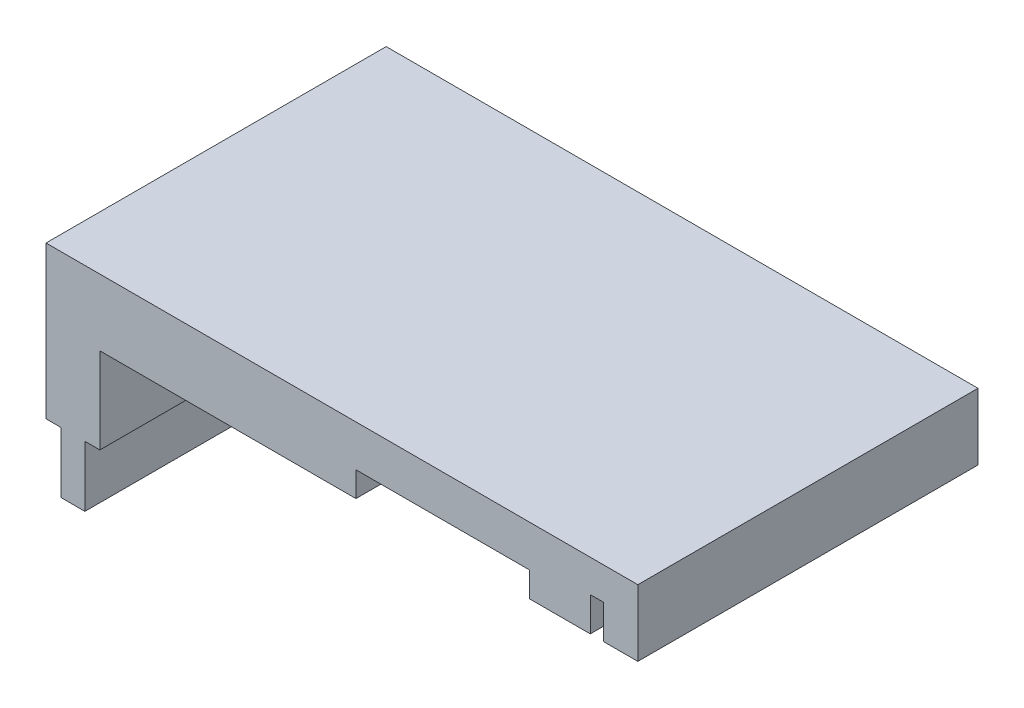
ISO-10303-21;
HEADER;
FILE_DESCRIPTION(('STEP AP214'),'2;1');
FILE_NAME('part.step','',(''),(''),'','','');
FILE_SCHEMA(('AUTOMOTIVE_DESIGN { 1 0 10303 214 1 1 1 1 }'));
ENDSEC;
DATA;
#1=APPLICATION_CONTEXT('core data for automotive mechanical design processes');
#2=APPLICATION_PROTOCOL_DEFINITION('international standard','automotive_design',2000,#1);
#3=PRODUCT_CONTEXT('',#1,'mechanical');
#4=PRODUCT('Part','Part','',(#3));
#5=PRODUCT_RELATED_PRODUCT_CATEGORY('part','',(#4));
#6=PRODUCT_DEFINITION_FORMATION('','',#4);
#7=PRODUCT_DEFINITION_CONTEXT('part definition',#1,'design');
#8=PRODUCT_DEFINITION('design','',#6,#7);
#9=PRODUCT_DEFINITION_SHAPE('','',#8);
#10=(LENGTH_UNIT() NAMED_UNIT(*) SI_UNIT(.MILLI.,.METRE.));
#11=(NAMED_UNIT(*) PLANE_ANGLE_UNIT() SI_UNIT($,.RADIAN.));
#12=(NAMED_UNIT(*) SI_UNIT($,.STERADIAN.) SOLID_ANGLE_UNIT());
#13=UNCERTAINTY_MEASURE_WITH_UNIT(LENGTH_MEASURE(1.E-05),#10,'distance_accuracy_value','');
#14=(GEOMETRIC_REPRESENTATION_CONTEXT(3) GLOBAL_UNCERTAINTY_ASSIGNED_CONTEXT((#13)) GLOBAL_UNIT_ASSIGNED_CONTEXT((#10,
#11,#12)) REPRESENTATION_CONTEXT('',''));
#15=CARTESIAN_POINT('',(0.,0.,0.));
#16=DIRECTION('',(0.,0.,1.));
#17=DIRECTION('',(1.,0.,0.));
#18=AXIS2_PLACEMENT_3D('',#15,#16,#17);
#19=CARTESIAN_POINT('',(-9.62999999999995,0.,95.25));
#20=DIRECTION('',(0.,1.,0.));
#21=DIRECTION('',(0.,0.,1.));
#22=AXIS2_PLACEMENT_3D('',#19,#20,#21);
#23=PLANE('',#22);
#24=DIRECTION('',(1.,0.,0.));
#25=VECTOR('',#24,1.);
#26=CARTESIAN_POINT('',(-9.62999999999995,0.,0.));
#27=LINE('',#26,#25);
#28=CARTESIAN_POINT('',(-9.62999999999995,0.,0.));
#29=VERTEX_POINT('',#28);
#30=CARTESIAN_POINT('',(0.,0.,0.));
#31=VERTEX_POINT('',#30);
#32=EDGE_CURVE('E181',#29,#31,#27,.T.);
#33=ORIENTED_EDGE('',*,*,#32,.T.);
#34=DIRECTION('',(0.,0.,-1.));
#35=VECTOR('',#34,1.);
#36=CARTESIAN_POINT('',(0.,0.,95.25));
#37=LINE('',#36,#35);
#38=CARTESIAN_POINT('',(0.,0.,95.25));
#39=VERTEX_POINT('',#38);
#40=EDGE_CURVE('E11',#39,#31,#37,.T.);
#41=ORIENTED_EDGE('',*,*,#40,.F.);
#42=DIRECTION('',(1.,0.,0.));
#43=VECTOR('',#42,1.);
#44=CARTESIAN_POINT('',(-9.62999999999995,0.,95.25));
#45=LINE('',#44,#43);
#46=CARTESIAN_POINT('',(-9.62999999999995,0.,95.25));
#47=VERTEX_POINT('',#46);
#48=EDGE_CURVE('E208',#47,#39,#45,.T.);
#49=ORIENTED_EDGE('',*,*,#48,.F.);
#50=DIRECTION('',(0.,0.,-1.));
#51=VECTOR('',#50,1.);
#52=CARTESIAN_POINT('',(-9.62999999999995,0.,95.25));
#53=LINE('',#52,#51);
#54=EDGE_CURVE('E177',#47,#29,#53,.T.);
#55=ORIENTED_EDGE('',*,*,#54,.T.);
#56=EDGE_LOOP('',(#33,#41,#49,#55));
#57=FACE_BOUND('',#56,.T.);
#58=ADVANCED_FACE('F32',(#57),#23,.F.);
#59=CARTESIAN_POINT('',(0.,0.,95.25));
#60=DIRECTION('',(-1.,0.,0.));
#61=DIRECTION('',(0.,0.,1.));
#62=AXIS2_PLACEMENT_3D('',#59,#60,#61);
#63=PLANE('',#62);
#64=DIRECTION('',(0.,1.,0.));
#65=VECTOR('',#64,1.);
#66=CARTESIAN_POINT('',(0.,0.,0.));
#67=LINE('',#66,#65);
#68=CARTESIAN_POINT('',(0.,18.61,0.));
#69=VERTEX_POINT('',#68);
#70=EDGE_CURVE('E184',#31,#69,#67,.T.);
#71=ORIENTED_EDGE('',*,*,#70,.T.);
#72=DIRECTION('',(0.,0.,-1.));
#73=VECTOR('',#72,1.);
#74=CARTESIAN_POINT('',(0.,18.61,95.25));
#75=LINE('',#74,#73);
#76=CARTESIAN_POINT('',(0.,18.61,95.25));
#77=VERTEX_POINT('',#76);
#78=EDGE_CURVE('E39',#77,#69,#75,.T.);
#79=ORIENTED_EDGE('',*,*,#78,.F.);
#80=DIRECTION('',(0.,1.,0.));
#81=VECTOR('',#80,1.);
#82=CARTESIAN_POINT('',(0.,0.,95.25));
#83=LINE('',#82,#81);
#84=EDGE_CURVE('E108',#39,#77,#83,.T.);
#85=ORIENTED_EDGE('',*,*,#84,.F.);
#86=ORIENTED_EDGE('',*,*,#40,.T.);
#87=EDGE_LOOP('',(#71,#79,#85,#86));
#88=FACE_BOUND('',#87,.T.);
#89=ADVANCED_FACE('F433',(#88),#63,.F.);
#90=CARTESIAN_POINT('',(0.,18.61,95.25));
#91=DIRECTION('',(0.,-1.,0.));
#92=DIRECTION('',(1.,0.,0.));
#93=AXIS2_PLACEMENT_3D('',#90,#91,#92);
#94=PLANE('',#93);
#95=DIRECTION('',(-1.,0.,0.));
#96=VECTOR('',#95,1.);
#97=CARTESIAN_POINT('',(0.,18.61,0.));
#98=LINE('',#97,#96);
#99=CARTESIAN_POINT('',(-165.72,18.61,0.));
#100=VERTEX_POINT('',#99);
#101=EDGE_CURVE('E187',#69,#100,#98,.T.);
#102=ORIENTED_EDGE('',*,*,#101,.T.);
#103=DIRECTION('',(0.,0.,-1.));
#104=VECTOR('',#103,1.);
#105=CARTESIAN_POINT('',(-165.72,18.61,95.25));
#106=LINE('',#105,#104);
#107=CARTESIAN_POINT('',(-165.72,18.61,95.25));
#108=VERTEX_POINT('',#107);
#109=EDGE_CURVE('E245',#108,#100,#106,.T.);
#110=ORIENTED_EDGE('',*,*,#109,.F.);
#111=DIRECTION('',(-1.,0.,0.));
#112=VECTOR('',#111,1.);
#113=CARTESIAN_POINT('',(0.,18.61,95.25));
#114=LINE('',#113,#112);
#115=EDGE_CURVE('E253',#77,#108,#114,.T.);
#116=ORIENTED_EDGE('',*,*,#115,.F.);
#117=ORIENTED_EDGE('',*,*,#78,.T.);
#118=EDGE_LOOP('',(#102,#110,#116,#117));
#119=FACE_BOUND('',#118,.T.);
#120=ADVANCED_FACE('F251',(#119),#94,.F.);
#121=CARTESIAN_POINT('',(-165.72,18.61,95.25));
#122=DIRECTION('',(1.,0.,0.));
#123=DIRECTION('',(0.,0.,-1.));
#124=AXIS2_PLACEMENT_3D('',#121,#122,#123);
#125=PLANE('',#124);
#126=DIRECTION('',(0.,0.,1.));
#127=VECTOR('',#126,1.);
#128=CARTESIAN_POINT('',(-165.72,0.,0.));
#129=LINE('',#128,#127);
#130=CARTESIAN_POINT('',(-165.72,0.,0.));
#131=VERTEX_POINT('',#130);
#132=CARTESIAN_POINT('',(-165.72,0.,9.));
#133=VERTEX_POINT('',#132);
#134=EDGE_CURVE('E46',#131,#133,#129,.T.);
#135=ORIENTED_EDGE('',*,*,#134,.T.);
#136=DIRECTION('',(0.,-1.,0.));
#137=VECTOR('',#136,1.);
#138=CARTESIAN_POINT('',(-165.72,0.,9.));
#139=LINE('',#138,#137);
#140=CARTESIAN_POINT('',(-165.72,-24.03,9.));
#141=VERTEX_POINT('',#140);
#142=EDGE_CURVE('E321',#133,#141,#139,.T.);
#143=ORIENTED_EDGE('',*,*,#142,.T.);
#144=DIRECTION('',(0.,0.,-1.));
#145=VECTOR('',#144,1.);
#146=CARTESIAN_POINT('',(-165.72,-24.03,95.25));
#147=LINE('',#146,#145);
#148=CARTESIAN_POINT('',(-165.72,-24.03,95.25));
#149=VERTEX_POINT('',#148);
#150=EDGE_CURVE('E242',#149,#141,#147,.T.);
#151=ORIENTED_EDGE('',*,*,#150,.F.);
#152=DIRECTION('',(0.,-1.,0.));
#153=VECTOR('',#152,1.);
#154=CARTESIAN_POINT('',(-165.72,18.61,95.25));
#155=LINE('',#154,#153);
#156=EDGE_CURVE('E266',#108,#149,#155,.T.);
#157=ORIENTED_EDGE('',*,*,#156,.F.);
#158=ORIENTED_EDGE('',*,*,#109,.T.);
#159=DIRECTION('',(0.,-1.,0.));
#160=VECTOR('',#159,1.);
#161=CARTESIAN_POINT('',(-165.72,18.61,0.));
#162=LINE('',#161,#160);
#163=EDGE_CURVE('E189',#100,#131,#162,.T.);
#164=ORIENTED_EDGE('',*,*,#163,.T.);
#165=EDGE_LOOP('',(#135,#143,#151,#157,#158,#164));
#166=FACE_BOUND('',#165,.T.);
#167=ADVANCED_FACE('F261',(#166),#125,.F.);
#168=CARTESIAN_POINT('',(-165.72,-24.03,95.25));
#169=DIRECTION('',(0.,1.,0.));
#170=DIRECTION('',(0.,0.,1.));
#171=AXIS2_PLACEMENT_3D('',#168,#169,#170);
#172=PLANE('',#171);
#173=ORIENTED_EDGE('',*,*,#150,.T.);
#174=DIRECTION('',(1.,0.,0.));
#175=VECTOR('',#174,1.);
#176=CARTESIAN_POINT('',(-165.72,-24.03,8.99999999999999));
#177=LINE('',#176,#175);
#178=CARTESIAN_POINT('',(-161.52,-24.03,8.99999999999999));
#179=VERTEX_POINT('',#178);
#180=EDGE_CURVE('E185',#141,#179,#177,.T.);
#181=ORIENTED_EDGE('',*,*,#180,.T.);
#182=DIRECTION('',(0.,0.,-1.));
#183=VECTOR('',#182,1.);
#184=CARTESIAN_POINT('',(-161.52,-24.03,95.25));
#185=LINE('',#184,#183);
#186=CARTESIAN_POINT('',(-161.52,-24.03,95.25));
#187=VERTEX_POINT('',#186);
#188=EDGE_CURVE('E239',#187,#179,#185,.T.);
#189=ORIENTED_EDGE('',*,*,#188,.F.);
#190=DIRECTION('',(1.,0.,0.));
#191=VECTOR('',#190,1.);
#192=CARTESIAN_POINT('',(-165.72,-24.03,95.25));
#193=LINE('',#192,#191);
#194=EDGE_CURVE('E268',#149,#187,#193,.T.);
#195=ORIENTED_EDGE('',*,*,#194,.F.);
#196=EDGE_LOOP('',(#173,#181,#189,#195));
#197=FACE_BOUND('',#196,.T.);
#198=ADVANCED_FACE('F405',(#197),#172,.F.);
#199=CARTESIAN_POINT('',(-161.52,-24.03,95.25));
#200=DIRECTION('',(1.,0.,0.));
#201=DIRECTION('',(0.,1.,0.));
#202=AXIS2_PLACEMENT_3D('',#199,#200,#201);
#203=PLANE('',#202);
#204=ORIENTED_EDGE('',*,*,#188,.T.);
#205=DIRECTION('',(0.,-1.,0.));
#206=VECTOR('',#205,1.);
#207=CARTESIAN_POINT('',(-161.52,-24.03,8.99999999999999));
#208=LINE('',#207,#206);
#209=CARTESIAN_POINT('',(-161.52,-41.03,8.99999999999999));
#210=VERTEX_POINT('',#209);
#211=EDGE_CURVE('E309',#179,#210,#208,.T.);
#212=ORIENTED_EDGE('',*,*,#211,.T.);
#213=DIRECTION('',(0.,0.,-1.));
#214=VECTOR('',#213,1.);
#215=CARTESIAN_POINT('',(-161.52,-41.03,95.25));
#216=LINE('',#215,#214);
#217=CARTESIAN_POINT('',(-161.52,-41.03,95.25));
#218=VERTEX_POINT('',#217);
#219=EDGE_CURVE('E236',#218,#210,#216,.T.);
#220=ORIENTED_EDGE('',*,*,#219,.F.);
#221=DIRECTION('',(0.,-1.,0.));
#222=VECTOR('',#221,1.);
#223=CARTESIAN_POINT('',(-161.52,-24.03,95.25));
#224=LINE('',#223,#222);
#225=EDGE_CURVE('E270',#187,#218,#224,.T.);
#226=ORIENTED_EDGE('',*,*,#225,.F.);
#227=EDGE_LOOP('',(#204,#212,#220,#226));
#228=FACE_BOUND('',#227,.T.);
#229=ADVANCED_FACE('F407',(#228),#203,.F.);
#230=CARTESIAN_POINT('',(-161.52,-41.03,95.25));
#231=DIRECTION('',(0.,1.,0.));
#232=DIRECTION('',(0.,0.,1.));
#233=AXIS2_PLACEMENT_3D('',#230,#231,#232);
#234=PLANE('',#233);
#235=ORIENTED_EDGE('',*,*,#219,.T.);
#236=DIRECTION('',(1.,0.,0.));
#237=VECTOR('',#236,1.);
#238=CARTESIAN_POINT('',(-165.72,-41.03,8.99999999999999));
#239=LINE('',#238,#237);
#240=CARTESIAN_POINT('',(-154.83,-41.03,8.99999999999999));
#241=VERTEX_POINT('',#240);
#242=EDGE_CURVE('E318',#210,#241,#239,.T.);
#243=ORIENTED_EDGE('',*,*,#242,.T.);
#244=DIRECTION('',(0.,0.,-1.));
#245=VECTOR('',#244,1.);
#246=CARTESIAN_POINT('',(-154.83,-41.03,95.25));
#247=LINE('',#246,#245);
#248=CARTESIAN_POINT('',(-154.83,-41.03,95.25));
#249=VERTEX_POINT('',#248);
#250=EDGE_CURVE('E233',#249,#241,#247,.T.);
#251=ORIENTED_EDGE('',*,*,#250,.F.);
#252=DIRECTION('',(1.,0.,0.));
#253=VECTOR('',#252,1.);
#254=CARTESIAN_POINT('',(-161.52,-41.03,95.25));
#255=LINE('',#254,#253);
#256=EDGE_CURVE('E276',#218,#249,#255,.T.);
#257=ORIENTED_EDGE('',*,*,#256,.F.);
#258=EDGE_LOOP('',(#235,#243,#251,#257));
#259=FACE_BOUND('',#258,.T.);
#260=ADVANCED_FACE('F413',(#259),#234,.F.);
#261=CARTESIAN_POINT('',(-154.83,-41.03,95.25));
#262=DIRECTION('',(-1.,0.,0.));
#263=DIRECTION('',(0.,0.,1.));
#264=AXIS2_PLACEMENT_3D('',#261,#262,#263);
#265=PLANE('',#264);
#266=ORIENTED_EDGE('',*,*,#250,.T.);
#267=DIRECTION('',(0.,1.,0.));
#268=VECTOR('',#267,1.);
#269=CARTESIAN_POINT('',(-154.83,-41.03,8.99999999999999));
#270=LINE('',#269,#268);
#271=CARTESIAN_POINT('',(-154.83,-24.03,8.99999999999999));
#272=VERTEX_POINT('',#271);
#273=EDGE_CURVE('E312',#241,#272,#270,.T.);
#274=ORIENTED_EDGE('',*,*,#273,.T.);
#275=DIRECTION('',(0.,0.,-1.));
#276=VECTOR('',#275,1.);
#277=CARTESIAN_POINT('',(-154.83,-24.03,95.25));
#278=LINE('',#277,#276);
#279=CARTESIAN_POINT('',(-154.83,-24.03,95.25));
#280=VERTEX_POINT('',#279);
#281=EDGE_CURVE('E230',#280,#272,#278,.T.);
#282=ORIENTED_EDGE('',*,*,#281,.F.);
#283=DIRECTION('',(0.,1.,0.));
#284=VECTOR('',#283,1.);
#285=CARTESIAN_POINT('',(-154.83,-41.03,95.25));
#286=LINE('',#285,#284);
#287=EDGE_CURVE('E278',#249,#280,#286,.T.);
#288=ORIENTED_EDGE('',*,*,#287,.F.);
#289=EDGE_LOOP('',(#266,#274,#282,#288));
#290=FACE_BOUND('',#289,.T.);
#291=ADVANCED_FACE('F415',(#290),#265,.F.);
#292=CARTESIAN_POINT('',(-154.83,-24.03,95.25));
#293=DIRECTION('',(0.,1.,0.));
#294=DIRECTION('',(0.,0.,1.));
#295=AXIS2_PLACEMENT_3D('',#292,#293,#294);
#296=PLANE('',#295);
#297=ORIENTED_EDGE('',*,*,#281,.T.);
#298=DIRECTION('',(1.,0.,0.));
#299=VECTOR('',#298,1.);
#300=CARTESIAN_POINT('',(-154.83,-24.03,8.99999999999999));
#301=LINE('',#300,#299);
#302=CARTESIAN_POINT('',(-150.63,-24.03,9.));
#303=VERTEX_POINT('',#302);
#304=EDGE_CURVE('E315',#272,#303,#301,.T.);
#305=ORIENTED_EDGE('',*,*,#304,.T.);
#306=DIRECTION('',(0.,0.,-1.));
#307=VECTOR('',#306,1.);
#308=CARTESIAN_POINT('',(-150.63,-24.03,95.25));
#309=LINE('',#308,#307);
#310=CARTESIAN_POINT('',(-150.63,-24.03,95.25));
#311=VERTEX_POINT('',#310);
#312=EDGE_CURVE('E227',#311,#303,#309,.T.);
#313=ORIENTED_EDGE('',*,*,#312,.F.);
#314=DIRECTION('',(1.,0.,0.));
#315=VECTOR('',#314,1.);
#316=CARTESIAN_POINT('',(-154.83,-24.03,95.25));
#317=LINE('',#316,#315);
#318=EDGE_CURVE('E280',#280,#311,#317,.T.);
#319=ORIENTED_EDGE('',*,*,#318,.F.);
#320=EDGE_LOOP('',(#297,#305,#313,#319));
#321=FACE_BOUND('',#320,.T.);
#322=ADVANCED_FACE('F419',(#321),#296,.F.);
#323=CARTESIAN_POINT('',(-150.63,-24.03,95.25));
#324=DIRECTION('',(-1.,0.,0.));
#325=DIRECTION('',(0.,0.,1.));
#326=AXIS2_PLACEMENT_3D('',#323,#324,#325);
#327=PLANE('',#326);
#328=ORIENTED_EDGE('',*,*,#312,.T.);
#329=DIRECTION('',(0.,-1.,0.));
#330=VECTOR('',#329,1.);
#331=CARTESIAN_POINT('',(-150.63,0.,9.));
#332=LINE('',#331,#330);
#333=CARTESIAN_POINT('',(-150.63,0.,9.));
#334=VERTEX_POINT('',#333);
#335=EDGE_CURVE('E326',#334,#303,#332,.T.);
#336=ORIENTED_EDGE('',*,*,#335,.F.);
#337=DIRECTION('',(0.,0.,1.));
#338=VECTOR('',#337,1.);
#339=CARTESIAN_POINT('',(-150.63,0.,0.));
#340=LINE('',#339,#338);
#341=CARTESIAN_POINT('',(-150.63,0.,0.));
#342=VERTEX_POINT('',#341);
#343=EDGE_CURVE('E329',#342,#334,#340,.T.);
#344=ORIENTED_EDGE('',*,*,#343,.F.);
#345=DIRECTION('',(0.,1.,0.));
#346=VECTOR('',#345,1.);
#347=CARTESIAN_POINT('',(-150.63,-24.03,0.));
#348=LINE('',#347,#346);
#349=CARTESIAN_POINT('',(-150.63,0.00999999999997878,0.));
#350=VERTEX_POINT('',#349);
#351=EDGE_CURVE('E192',#342,#350,#348,.T.);
#352=ORIENTED_EDGE('',*,*,#351,.T.);
#353=DIRECTION('',(0.,0.,-1.));
#354=VECTOR('',#353,1.);
#355=CARTESIAN_POINT('',(-150.63,0.00999999999997878,95.25));
#356=LINE('',#355,#354);
#357=CARTESIAN_POINT('',(-150.63,0.00999999999997878,95.25));
#358=VERTEX_POINT('',#357);
#359=EDGE_CURVE('E224',#358,#350,#356,.T.);
#360=ORIENTED_EDGE('',*,*,#359,.F.);
#361=DIRECTION('',(0.,1.,0.));
#362=VECTOR('',#361,1.);
#363=CARTESIAN_POINT('',(-150.63,-24.03,95.25));
#364=LINE('',#363,#362);
#365=EDGE_CURVE('E282',#311,#358,#364,.T.);
#366=ORIENTED_EDGE('',*,*,#365,.F.);
#367=EDGE_LOOP('',(#328,#336,#344,#352,#360,#366));
#368=FACE_BOUND('',#367,.T.);
#369=ADVANCED_FACE('F376',(#368),#327,.F.);
#370=CARTESIAN_POINT('',(-150.63,0.00999999999997878,95.25));
#371=DIRECTION('',(0.,1.,0.));
#372=DIRECTION('',(0.,0.,1.));
#373=AXIS2_PLACEMENT_3D('',#370,#371,#372);
#374=PLANE('',#373);
#375=DIRECTION('',(1.,0.,0.));
#376=VECTOR('',#375,1.);
#377=CARTESIAN_POINT('',(-150.63,0.00999999999997878,0.));
#378=LINE('',#377,#376);
#379=CARTESIAN_POINT('',(-78.94,0.00999999999997878,0.));
#380=VERTEX_POINT('',#379);
#381=EDGE_CURVE('E194',#350,#380,#378,.T.);
#382=ORIENTED_EDGE('',*,*,#381,.T.);
#383=DIRECTION('',(0.,0.,-1.));
#384=VECTOR('',#383,1.);
#385=CARTESIAN_POINT('',(-78.94,0.00999999999997878,95.25));
#386=LINE('',#385,#384);
#387=CARTESIAN_POINT('',(-78.94,0.00999999999997878,95.25));
#388=VERTEX_POINT('',#387);
#389=EDGE_CURVE('E221',#388,#380,#386,.T.);
#390=ORIENTED_EDGE('',*,*,#389,.F.);
#391=DIRECTION('',(1.,0.,0.));
#392=VECTOR('',#391,1.);
#393=CARTESIAN_POINT('',(-150.63,0.00999999999997878,95.25));
#394=LINE('',#393,#392);
#395=EDGE_CURVE('E284',#358,#388,#394,.T.);
#396=ORIENTED_EDGE('',*,*,#395,.F.);
#397=ORIENTED_EDGE('',*,*,#359,.T.);
#398=EDGE_LOOP('',(#382,#390,#396,#397));
#399=FACE_BOUND('',#398,.T.);
#400=ADVANCED_FACE('F372',(#399),#374,.F.);
#401=CARTESIAN_POINT('',(-78.94,0.00999999999997878,95.25));
#402=DIRECTION('',(-1.,0.,0.));
#403=DIRECTION('',(0.,0.,1.));
#404=AXIS2_PLACEMENT_3D('',#401,#402,#403);
#405=PLANE('',#404);
#406=DIRECTION('',(0.,1.,0.));
#407=VECTOR('',#406,1.);
#408=CARTESIAN_POINT('',(-78.94,0.00999999999997878,0.));
#409=LINE('',#408,#407);
#410=CARTESIAN_POINT('',(-78.94,7.00999999999998,0.));
#411=VERTEX_POINT('',#410);
#412=EDGE_CURVE('E196',#380,#411,#409,.T.);
#413=ORIENTED_EDGE('',*,*,#412,.T.);
#414=DIRECTION('',(0.,0.,-1.));
#415=VECTOR('',#414,1.);
#416=CARTESIAN_POINT('',(-78.94,7.00999999999998,95.25));
#417=LINE('',#416,#415);
#418=CARTESIAN_POINT('',(-78.94,7.00999999999998,95.25));
#419=VERTEX_POINT('',#418);
#420=EDGE_CURVE('E218',#419,#411,#417,.T.);
#421=ORIENTED_EDGE('',*,*,#420,.F.);
#422=DIRECTION('',(0.,1.,0.));
#423=VECTOR('',#422,1.);
#424=CARTESIAN_POINT('',(-78.94,0.00999999999997878,95.25));
#425=LINE('',#424,#423);
#426=EDGE_CURVE('E286',#388,#419,#425,.T.);
#427=ORIENTED_EDGE('',*,*,#426,.F.);
#428=ORIENTED_EDGE('',*,*,#389,.T.);
#429=EDGE_LOOP('',(#413,#421,#427,#428));
#430=FACE_BOUND('',#429,.T.);
#431=ADVANCED_FACE('F359',(#430),#405,.F.);
#432=CARTESIAN_POINT('',(-78.94,7.00999999999998,95.25));
#433=DIRECTION('',(0.,1.,0.));
#434=DIRECTION('',(0.,0.,1.));
#435=AXIS2_PLACEMENT_3D('',#432,#433,#434);
#436=PLANE('',#435);
#437=CARTESIAN_POINT('',(-69.0799999999999,7.00999999999998,42.44));
#438=DIRECTION('',(0.,-1.,0.));
#439=DIRECTION('',(0.,0.,-1.));
#440=AXIS2_PLACEMENT_3D('',#437,#438,#439);
#441=CIRCLE('',#440,1.03);
#442=CARTESIAN_POINT('',(-69.0799999999999,7.00999999999998,41.41));
#443=VERTEX_POINT('',#442);
#444=EDGE_CURVE('E341',#443,#443,#441,.T.);
#445=ORIENTED_EDGE('',*,*,#444,.F.);
#446=EDGE_LOOP('',(#445));
#447=FACE_BOUND('',#446,.T.);
#448=CARTESIAN_POINT('',(-49.5799999999999,7.00999999999998,60.2));
#449=DIRECTION('',(0.,-1.,0.));
#450=DIRECTION('',(0.,0.,-1.));
#451=AXIS2_PLACEMENT_3D('',#448,#449,#450);
#452=CIRCLE('',#451,1.03);
#453=CARTESIAN_POINT('',(-49.5799999999999,7.00999999999998,59.17));
#454=VERTEX_POINT('',#453);
#455=EDGE_CURVE('E335',#454,#454,#452,.T.);
#456=ORIENTED_EDGE('',*,*,#455,.F.);
#457=EDGE_LOOP('',(#456));
#458=FACE_BOUND('',#457,.T.);
#459=DIRECTION('',(1.,0.,0.));
#460=VECTOR('',#459,1.);
#461=CARTESIAN_POINT('',(-78.94,7.00999999999998,0.));
#462=LINE('',#461,#460);
#463=CARTESIAN_POINT('',(-30.2699999999999,7.00999999999998,0.));
#464=VERTEX_POINT('',#463);
#465=EDGE_CURVE('E198',#411,#464,#462,.T.);
#466=ORIENTED_EDGE('',*,*,#465,.T.);
#467=DIRECTION('',(0.,0.,-1.));
#468=VECTOR('',#467,1.);
#469=CARTESIAN_POINT('',(-30.2699999999999,7.00999999999998,95.25));
#470=LINE('',#469,#468);
#471=CARTESIAN_POINT('',(-30.2699999999999,7.00999999999998,95.25));
#472=VERTEX_POINT('',#471);
#473=EDGE_CURVE('E215',#472,#464,#470,.T.);
#474=ORIENTED_EDGE('',*,*,#473,.F.);
#475=DIRECTION('',(1.,0.,0.));
#476=VECTOR('',#475,1.);
#477=CARTESIAN_POINT('',(-78.94,7.00999999999998,95.25));
#478=LINE('',#477,#476);
#479=EDGE_CURVE('E288',#419,#472,#478,.T.);
#480=ORIENTED_EDGE('',*,*,#479,.F.);
#481=ORIENTED_EDGE('',*,*,#420,.T.);
#482=EDGE_LOOP('',(#466,#474,#480,#481));
#483=FACE_BOUND('',#482,.T.);
#484=ADVANCED_FACE('F356',(#447,#458,#483),#436,.F.);
#485=CARTESIAN_POINT('',(-30.2699999999999,7.00999999999998,95.25));
#486=DIRECTION('',(1.,0.,0.));
#487=DIRECTION('',(0.,0.,-1.));
#488=AXIS2_PLACEMENT_3D('',#485,#486,#487);
#489=PLANE('',#488);
#490=DIRECTION('',(0.,-1.,0.));
#491=VECTOR('',#490,1.);
#492=CARTESIAN_POINT('',(-30.2699999999999,7.00999999999998,0.));
#493=LINE('',#492,#491);
#494=CARTESIAN_POINT('',(-30.2699999999999,0.00999999999997878,0.));
#495=VERTEX_POINT('',#494);
#496=EDGE_CURVE('E200',#464,#495,#493,.T.);
#497=ORIENTED_EDGE('',*,*,#496,.T.);
#498=DIRECTION('',(0.,0.,-1.));
#499=VECTOR('',#498,1.);
#500=CARTESIAN_POINT('',(-30.2699999999999,0.00999999999997878,95.25));
#501=LINE('',#500,#499);
#502=CARTESIAN_POINT('',(-30.2699999999999,0.00999999999997878,95.25));
#503=VERTEX_POINT('',#502);
#504=EDGE_CURVE('E212',#503,#495,#501,.T.);
#505=ORIENTED_EDGE('',*,*,#504,.F.);
#506=DIRECTION('',(0.,-1.,0.));
#507=VECTOR('',#506,1.);
#508=CARTESIAN_POINT('',(-30.2699999999999,7.00999999999998,95.25));
#509=LINE('',#508,#507);
#510=EDGE_CURVE('E290',#472,#503,#509,.T.);
#511=ORIENTED_EDGE('',*,*,#510,.F.);
#512=ORIENTED_EDGE('',*,*,#473,.T.);
#513=EDGE_LOOP('',(#497,#505,#511,#512));
#514=FACE_BOUND('',#513,.T.);
#515=ADVANCED_FACE('F296',(#514),#489,.F.);
#516=CARTESIAN_POINT('',(-30.2699999999999,0.00999999999997878,95.25));
#517=DIRECTION('',(0.,1.,0.));
#518=DIRECTION('',(0.,0.,1.));
#519=AXIS2_PLACEMENT_3D('',#516,#517,#518);
#520=PLANE('',#519);
#521=DIRECTION('',(1.,0.,0.));
#522=VECTOR('',#521,1.);
#523=CARTESIAN_POINT('',(-30.2699999999999,0.00999999999997878,0.));
#524=LINE('',#523,#522);
#525=CARTESIAN_POINT('',(-13.32,0.00999999999997878,0.));
#526=VERTEX_POINT('',#525);
#527=EDGE_CURVE('E202',#495,#526,#524,.T.);
#528=ORIENTED_EDGE('',*,*,#527,.T.);
#529=DIRECTION('',(0.,0.,-1.));
#530=VECTOR('',#529,1.);
#531=CARTESIAN_POINT('',(-13.32,0.00999999999997878,95.25));
#532=LINE('',#531,#530);
#533=CARTESIAN_POINT('',(-13.32,0.00999999999997878,95.25));
#534=VERTEX_POINT('',#533);
#535=EDGE_CURVE('E172',#534,#526,#532,.T.);
#536=ORIENTED_EDGE('',*,*,#535,.F.);
#537=DIRECTION('',(1.,0.,0.));
#538=VECTOR('',#537,1.);
#539=CARTESIAN_POINT('',(-30.2699999999999,0.00999999999997878,95.25));
#540=LINE('',#539,#538);
#541=EDGE_CURVE('E160',#503,#534,#540,.T.);
#542=ORIENTED_EDGE('',*,*,#541,.F.);
#543=ORIENTED_EDGE('',*,*,#504,.T.);
#544=EDGE_LOOP('',(#528,#536,#542,#543));
#545=FACE_BOUND('',#544,.T.);
#546=ADVANCED_FACE('F300',(#545),#520,.F.);
#547=CARTESIAN_POINT('',(-13.32,0.00999999999997878,95.25));
#548=DIRECTION('',(-1.,0.,0.));
#549=DIRECTION('',(0.,0.,1.));
#550=AXIS2_PLACEMENT_3D('',#547,#548,#549);
#551=PLANE('',#550);
#552=DIRECTION('',(0.,1.,0.));
#553=VECTOR('',#552,1.);
#554=CARTESIAN_POINT('',(-13.32,0.00999999999997878,0.));
#555=LINE('',#554,#553);
#556=CARTESIAN_POINT('',(-13.32,9.53999999999998,0.));
#557=VERTEX_POINT('',#556);
#558=EDGE_CURVE('E169',#526,#557,#555,.T.);
#559=ORIENTED_EDGE('',*,*,#558,.T.);
#560=DIRECTION('',(0.,0.,-1.));
#561=VECTOR('',#560,1.);
#562=CARTESIAN_POINT('',(-13.32,9.53999999999998,95.25));
#563=LINE('',#562,#561);
#564=CARTESIAN_POINT('',(-13.32,9.53999999999998,95.25));
#565=VERTEX_POINT('',#564);
#566=EDGE_CURVE('E166',#565,#557,#563,.T.);
#567=ORIENTED_EDGE('',*,*,#566,.F.);
#568=DIRECTION('',(0.,1.,0.));
#569=VECTOR('',#568,1.);
#570=CARTESIAN_POINT('',(-13.32,0.00999999999997878,95.25));
#571=LINE('',#570,#569);
#572=EDGE_CURVE('E153',#534,#565,#571,.T.);
#573=ORIENTED_EDGE('',*,*,#572,.F.);
#574=ORIENTED_EDGE('',*,*,#535,.T.);
#575=EDGE_LOOP('',(#559,#567,#573,#574));
#576=FACE_BOUND('',#575,.T.);
#577=ADVANCED_FACE('F167',(#576),#551,.F.);
#578=CARTESIAN_POINT('',(-13.32,9.53999999999998,95.25));
#579=DIRECTION('',(0.,1.,0.));
#580=DIRECTION('',(0.,0.,1.));
#581=AXIS2_PLACEMENT_3D('',#578,#579,#580);
#582=PLANE('',#581);
#583=DIRECTION('',(1.,0.,0.));
#584=VECTOR('',#583,1.);
#585=CARTESIAN_POINT('',(-13.32,9.53999999999998,0.));
#586=LINE('',#585,#584);
#587=CARTESIAN_POINT('',(-9.62999999999995,9.53999999999998,0.));
#588=VERTEX_POINT('',#587);
#589=EDGE_CURVE('E205',#557,#588,#586,.T.);
#590=ORIENTED_EDGE('',*,*,#589,.T.);
#591=DIRECTION('',(0.,0.,-1.));
#592=VECTOR('',#591,1.);
#593=CARTESIAN_POINT('',(-9.62999999999995,9.53999999999998,95.25));
#594=LINE('',#593,#592);
#595=CARTESIAN_POINT('',(-9.62999999999995,9.53999999999998,95.25));
#596=VERTEX_POINT('',#595);
#597=EDGE_CURVE('E173',#596,#588,#594,.T.);
#598=ORIENTED_EDGE('',*,*,#597,.F.);
#599=DIRECTION('',(1.,0.,0.));
#600=VECTOR('',#599,1.);
#601=CARTESIAN_POINT('',(-13.32,9.53999999999998,95.25));
#602=LINE('',#601,#600);
#603=EDGE_CURVE('E157',#565,#596,#602,.T.);
#604=ORIENTED_EDGE('',*,*,#603,.F.);
#605=ORIENTED_EDGE('',*,*,#566,.T.);
#606=EDGE_LOOP('',(#590,#598,#604,#605));
#607=FACE_BOUND('',#606,.T.);
#608=ADVANCED_FACE('F175',(#607),#582,.F.);
#609=CARTESIAN_POINT('',(-9.62999999999995,9.53999999999998,95.25));
#610=DIRECTION('',(1.,0.,0.));
#611=DIRECTION('',(0.,1.,0.));
#612=AXIS2_PLACEMENT_3D('',#609,#610,#611);
#613=PLANE('',#612);
#614=DIRECTION('',(0.,-1.,0.));
#615=VECTOR('',#614,1.);
#616=CARTESIAN_POINT('',(-9.62999999999995,9.53999999999998,0.));
#617=LINE('',#616,#615);
#618=EDGE_CURVE('E100',#588,#29,#617,.T.);
#619=ORIENTED_EDGE('',*,*,#618,.T.);
#620=ORIENTED_EDGE('',*,*,#54,.F.);
#621=DIRECTION('',(0.,-1.,0.));
#622=VECTOR('',#621,1.);
#623=CARTESIAN_POINT('',(-9.62999999999995,9.53999999999998,95.25));
#624=LINE('',#623,#622);
#625=EDGE_CURVE('E55',#596,#47,#624,.T.);
#626=ORIENTED_EDGE('',*,*,#625,.F.);
#627=ORIENTED_EDGE('',*,*,#597,.T.);
#628=EDGE_LOOP('',(#619,#620,#626,#627));
#629=FACE_BOUND('',#628,.T.);
#630=ADVANCED_FACE('F301',(#629),#613,.F.);
#631=CARTESIAN_POINT('',(0.,0.,95.25));
#632=DIRECTION('',(0.,0.,1.));
#633=DIRECTION('',(1.,0.,0.));
#634=AXIS2_PLACEMENT_3D('',#631,#632,#633);
#635=PLANE('',#634);
#636=ORIENTED_EDGE('',*,*,#48,.T.);
#637=ORIENTED_EDGE('',*,*,#84,.T.);
#638=ORIENTED_EDGE('',*,*,#115,.T.);
#639=ORIENTED_EDGE('',*,*,#156,.T.);
#640=ORIENTED_EDGE('',*,*,#194,.T.);
#641=ORIENTED_EDGE('',*,*,#225,.T.);
#642=ORIENTED_EDGE('',*,*,#256,.T.);
#643=ORIENTED_EDGE('',*,*,#287,.T.);
#644=ORIENTED_EDGE('',*,*,#318,.T.);
#645=ORIENTED_EDGE('',*,*,#365,.T.);
#646=ORIENTED_EDGE('',*,*,#395,.T.);
#647=ORIENTED_EDGE('',*,*,#426,.T.);
#648=ORIENTED_EDGE('',*,*,#479,.T.);
#649=ORIENTED_EDGE('',*,*,#510,.T.);
#650=ORIENTED_EDGE('',*,*,#541,.T.);
#651=ORIENTED_EDGE('',*,*,#572,.T.);
#652=ORIENTED_EDGE('',*,*,#603,.T.);
#653=ORIENTED_EDGE('',*,*,#625,.T.);
#654=EDGE_LOOP('',(#636,#637,#638,#639,#640,#641,#642,#643,#644,#645,#646,#647,#648,#649,#650,
#651,#652,#653));
#655=FACE_BOUND('',#654,.T.);
#656=ADVANCED_FACE('F155',(#655),#635,.T.);
#657=CARTESIAN_POINT('',(0.,0.,0.));
#658=DIRECTION('',(0.,0.,1.));
#659=DIRECTION('',(1.,0.,0.));
#660=AXIS2_PLACEMENT_3D('',#657,#658,#659);
#661=PLANE('',#660);
#662=ORIENTED_EDGE('',*,*,#351,.F.);
#663=DIRECTION('',(1.,0.,0.));
#664=VECTOR('',#663,1.);
#665=CARTESIAN_POINT('',(-165.72,0.,0.));
#666=LINE('',#665,#664);
#667=EDGE_CURVE('E259',#131,#342,#666,.T.);
#668=ORIENTED_EDGE('',*,*,#667,.F.);
#669=ORIENTED_EDGE('',*,*,#163,.F.);
#670=ORIENTED_EDGE('',*,*,#101,.F.);
#671=ORIENTED_EDGE('',*,*,#70,.F.);
#672=ORIENTED_EDGE('',*,*,#32,.F.);
#673=ORIENTED_EDGE('',*,*,#618,.F.);
#674=ORIENTED_EDGE('',*,*,#589,.F.);
#675=ORIENTED_EDGE('',*,*,#558,.F.);
#676=ORIENTED_EDGE('',*,*,#527,.F.);
#677=ORIENTED_EDGE('',*,*,#496,.F.);
#678=ORIENTED_EDGE('',*,*,#465,.F.);
#679=ORIENTED_EDGE('',*,*,#412,.F.);
#680=ORIENTED_EDGE('',*,*,#381,.F.);
#681=EDGE_LOOP('',(#662,#668,#669,#670,#671,#672,#673,#674,#675,#676,#677,#678,#679,#680));
#682=FACE_BOUND('',#681,.T.);
#683=ADVANCED_FACE('F257',(#682),#661,.F.);
#684=CARTESIAN_POINT('',(-165.72,0.,9.));
#685=DIRECTION('',(0.,0.,1.));
#686=DIRECTION('',(0.,-1.,0.));
#687=AXIS2_PLACEMENT_3D('',#684,#685,#686);
#688=PLANE('',#687);
#689=ORIENTED_EDGE('',*,*,#142,.F.);
#690=DIRECTION('',(1.,0.,0.));
#691=VECTOR('',#690,1.);
#692=CARTESIAN_POINT('',(-165.72,0.,9.));
#693=LINE('',#692,#691);
#694=EDGE_CURVE('E320',#133,#334,#693,.T.);
#695=ORIENTED_EDGE('',*,*,#694,.T.);
#696=ORIENTED_EDGE('',*,*,#335,.T.);
#697=ORIENTED_EDGE('',*,*,#304,.F.);
#698=ORIENTED_EDGE('',*,*,#273,.F.);
#699=ORIENTED_EDGE('',*,*,#242,.F.);
#700=ORIENTED_EDGE('',*,*,#211,.F.);
#701=ORIENTED_EDGE('',*,*,#180,.F.);
#702=EDGE_LOOP('',(#689,#695,#696,#697,#698,#699,#700,#701));
#703=FACE_BOUND('',#702,.T.);
#704=ADVANCED_FACE('F400',(#703),#688,.F.);
#705=CARTESIAN_POINT('',(-165.72,0.,0.));
#706=DIRECTION('',(0.,1.,0.));
#707=DIRECTION('',(0.,0.,1.));
#708=AXIS2_PLACEMENT_3D('',#705,#706,#707);
#709=PLANE('',#708);
#710=ORIENTED_EDGE('',*,*,#343,.T.);
#711=ORIENTED_EDGE('',*,*,#694,.F.);
#712=ORIENTED_EDGE('',*,*,#134,.F.);
#713=ORIENTED_EDGE('',*,*,#667,.T.);
#714=EDGE_LOOP('',(#710,#711,#712,#713));
#715=FACE_BOUND('',#714,.T.);
#716=ADVANCED_FACE('F420',(#715),#709,.F.);
#717=CARTESIAN_POINT('',(-49.5799999999999,10.01,60.2));
#718=DIRECTION('',(0.,-1.,0.));
#719=DIRECTION('',(0.,0.,-1.));
#720=AXIS2_PLACEMENT_3D('',#717,#718,#719);
#721=CYLINDRICAL_SURFACE('',#720,1.03);
#722=CARTESIAN_POINT('',(-49.5799999999999,10.01,60.2));
#723=DIRECTION('',(0.,-1.,0.));
#724=DIRECTION('',(0.,0.,-1.));
#725=AXIS2_PLACEMENT_3D('',#722,#723,#724);
#726=CIRCLE('',#725,1.03);
#727=CARTESIAN_POINT('',(-49.5799999999999,10.01,59.17));
#728=VERTEX_POINT('',#727);
#729=EDGE_CURVE('E338',#728,#728,#726,.T.);
#730=ORIENTED_EDGE('',*,*,#729,.F.);
#731=EDGE_LOOP('',(#730));
#732=FACE_BOUND('',#731,.T.);
#733=ORIENTED_EDGE('',*,*,#455,.T.);
#734=EDGE_LOOP('',(#733));
#735=FACE_BOUND('',#734,.T.);
#736=ADVANCED_FACE('F422',(#732,#735),#721,.F.);
#737=CARTESIAN_POINT('',(-49.5799999999999,10.01,60.2));
#738=DIRECTION('',(0.,-1.,0.));
#739=DIRECTION('',(0.,0.,-1.));
#740=AXIS2_PLACEMENT_3D('',#737,#738,#739);
#741=PLANE('',#740);
#742=ORIENTED_EDGE('',*,*,#729,.T.);
#743=EDGE_LOOP('',(#742));
#744=FACE_BOUND('',#743,.T.);
#745=ADVANCED_FACE('F352',(#744),#741,.T.);
#746=CARTESIAN_POINT('',(-69.0799999999999,10.01,42.44));
#747=DIRECTION('',(0.,-1.,0.));
#748=DIRECTION('',(0.,0.,-1.));
#749=AXIS2_PLACEMENT_3D('',#746,#747,#748);
#750=CYLINDRICAL_SURFACE('',#749,1.03);
#751=CARTESIAN_POINT('',(-69.0799999999999,10.01,42.44));
#752=DIRECTION('',(0.,-1.,0.));
#753=DIRECTION('',(0.,0.,-1.));
#754=AXIS2_PLACEMENT_3D('',#751,#752,#753);
#755=CIRCLE('',#754,1.03);
#756=CARTESIAN_POINT('',(-69.0799999999999,10.01,41.41));
#757=VERTEX_POINT('',#756);
#758=EDGE_CURVE('E332',#757,#757,#755,.T.);
#759=ORIENTED_EDGE('',*,*,#758,.F.);
#760=EDGE_LOOP('',(#759));
#761=FACE_BOUND('',#760,.T.);
#762=ORIENTED_EDGE('',*,*,#444,.T.);
#763=EDGE_LOOP('',(#762));
#764=FACE_BOUND('',#763,.T.);
#765=ADVANCED_FACE('F349',(#761,#764),#750,.F.);
#766=CARTESIAN_POINT('',(-69.0799999999999,10.01,42.44));
#767=DIRECTION('',(0.,-1.,0.));
#768=DIRECTION('',(0.,0.,-1.));
#769=AXIS2_PLACEMENT_3D('',#766,#767,#768);
#770=PLANE('',#769);
#771=ORIENTED_EDGE('',*,*,#758,.T.);
#772=EDGE_LOOP('',(#771));
#773=FACE_BOUND('',#772,.T.);
#774=ADVANCED_FACE('F347',(#773),#770,.T.);
#775=CLOSED_SHELL('',(#58,#89,#120,#167,#198,#229,#260,#291,#322,#369,#400,#431,#484,#515,#546,
#577,#608,#630,#656,#683,#704,#716,#736,#745,#765,#774));
#776=MANIFOLD_SOLID_BREP('B2',#775);
#777=ADVANCED_BREP_SHAPE_REPRESENTATION('',(#18,#776),#14);
#778=SHAPE_DEFINITION_REPRESENTATION(#9,#777);
ENDSEC;
END-ISO-10303-21;
